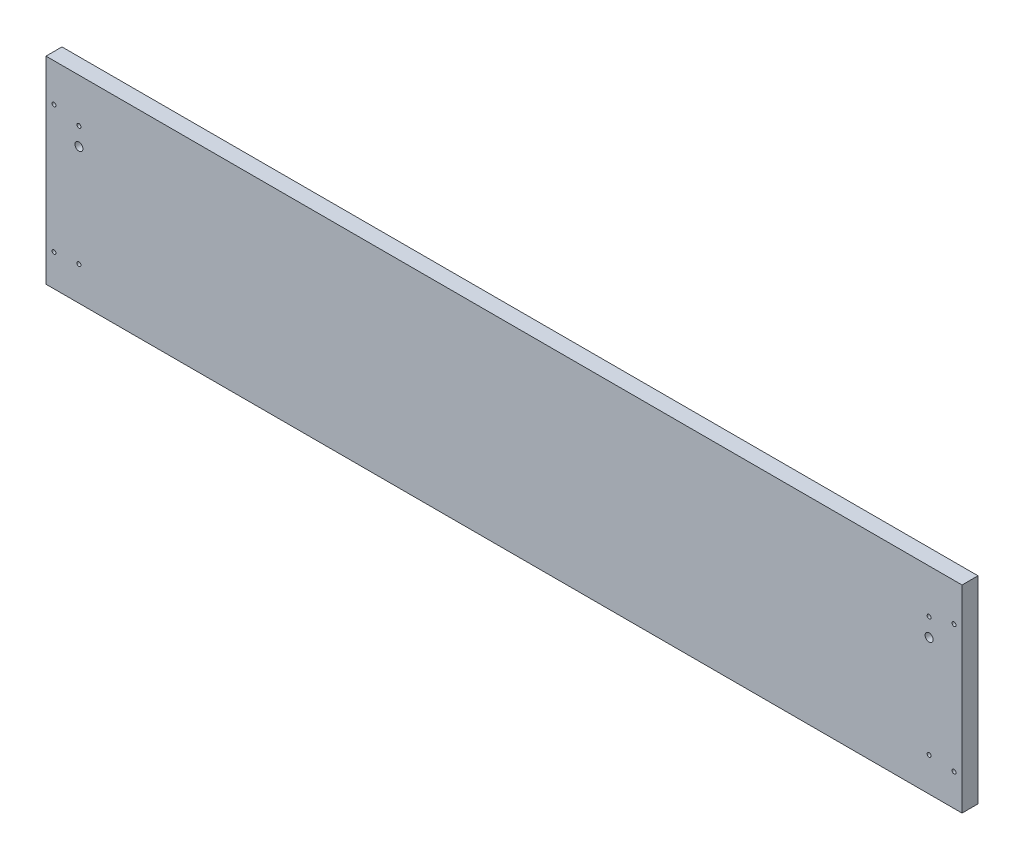
ISO-10303-21;
HEADER;
FILE_DESCRIPTION(('STEP AP214'),'2;1');
FILE_NAME('part.step','',(''),(''),'','','');
FILE_SCHEMA(('AUTOMOTIVE_DESIGN { 1 0 10303 214 1 1 1 1 }'));
ENDSEC;
DATA;
#1=APPLICATION_CONTEXT('core data for automotive mechanical design processes');
#2=APPLICATION_PROTOCOL_DEFINITION('international standard','automotive_design',2000,#1);
#3=PRODUCT_CONTEXT('',#1,'mechanical');
#4=PRODUCT('Part','Part','',(#3));
#5=PRODUCT_RELATED_PRODUCT_CATEGORY('part','',(#4));
#6=PRODUCT_DEFINITION_FORMATION('','',#4);
#7=PRODUCT_DEFINITION_CONTEXT('part definition',#1,'design');
#8=PRODUCT_DEFINITION('design','',#6,#7);
#9=PRODUCT_DEFINITION_SHAPE('','',#8);
#10=(LENGTH_UNIT() NAMED_UNIT(*) SI_UNIT(.MILLI.,.METRE.));
#11=(NAMED_UNIT(*) PLANE_ANGLE_UNIT() SI_UNIT($,.RADIAN.));
#12=(NAMED_UNIT(*) SI_UNIT($,.STERADIAN.) SOLID_ANGLE_UNIT());
#13=UNCERTAINTY_MEASURE_WITH_UNIT(LENGTH_MEASURE(1.E-05),#10,'distance_accuracy_value','');
#14=(GEOMETRIC_REPRESENTATION_CONTEXT(3) GLOBAL_UNCERTAINTY_ASSIGNED_CONTEXT((#13)) GLOBAL_UNIT_ASSIGNED_CONTEXT((#10,
#11,#12)) REPRESENTATION_CONTEXT('',''));
#15=CARTESIAN_POINT('',(0.,0.,0.));
#16=DIRECTION('',(0.,0.,1.));
#17=DIRECTION('',(1.,0.,0.));
#18=AXIS2_PLACEMENT_3D('',#15,#16,#17);
#19=CARTESIAN_POINT('',(-5740.4,1206.5,-12.7));
#20=DIRECTION('',(0.,-1.,0.));
#21=DIRECTION('',(0.,0.,-1.));
#22=AXIS2_PLACEMENT_3D('',#19,#20,#21);
#23=PLANE('',#22);
#24=DIRECTION('',(1.,0.,0.));
#25=VECTOR('',#24,1.);
#26=CARTESIAN_POINT('',(-5740.4,1206.5,0.));
#27=LINE('',#26,#25);
#28=CARTESIAN_POINT('',(-5740.4,1206.5,0.));
#29=VERTEX_POINT('',#28);
#30=CARTESIAN_POINT('',(-5011.7375,1206.5,0.));
#31=VERTEX_POINT('',#30);
#32=EDGE_CURVE('E96',#29,#31,#27,.T.);
#33=ORIENTED_EDGE('',*,*,#32,.F.);
#34=DIRECTION('',(0.,0.,1.));
#35=VECTOR('',#34,1.);
#36=CARTESIAN_POINT('',(-5740.4,1206.5,-12.7));
#37=LINE('',#36,#35);
#38=CARTESIAN_POINT('',(-5740.4,1206.5,-12.7));
#39=VERTEX_POINT('',#38);
#40=EDGE_CURVE('E11',#39,#29,#37,.T.);
#41=ORIENTED_EDGE('',*,*,#40,.F.);
#42=DIRECTION('',(1.,0.,0.));
#43=VECTOR('',#42,1.);
#44=CARTESIAN_POINT('',(-5740.4,1206.5,-12.7));
#45=LINE('',#44,#43);
#46=CARTESIAN_POINT('',(-5011.7375,1206.5,-12.7));
#47=VERTEX_POINT('',#46);
#48=EDGE_CURVE('E89',#39,#47,#45,.T.);
#49=ORIENTED_EDGE('',*,*,#48,.T.);
#50=DIRECTION('',(0.,0.,1.));
#51=VECTOR('',#50,1.);
#52=CARTESIAN_POINT('',(-5011.7375,1206.5,-12.7));
#53=LINE('',#52,#51);
#54=EDGE_CURVE('E34',#47,#31,#53,.T.);
#55=ORIENTED_EDGE('',*,*,#54,.T.);
#56=EDGE_LOOP('',(#33,#41,#49,#55));
#57=FACE_BOUND('',#56,.T.);
#58=ADVANCED_FACE('F31',(#57),#23,.T.);
#59=CARTESIAN_POINT('',(-5740.4,1363.6625,-12.7));
#60=DIRECTION('',(-1.,0.,0.));
#61=DIRECTION('',(0.,0.,1.));
#62=AXIS2_PLACEMENT_3D('',#59,#60,#61);
#63=PLANE('',#62);
#64=DIRECTION('',(0.,-1.,0.));
#65=VECTOR('',#64,1.);
#66=CARTESIAN_POINT('',(-5740.4,1363.6625,0.));
#67=LINE('',#66,#65);
#68=CARTESIAN_POINT('',(-5740.4,1363.6625,0.));
#69=VERTEX_POINT('',#68);
#70=EDGE_CURVE('E91',#69,#29,#67,.T.);
#71=ORIENTED_EDGE('',*,*,#70,.F.);
#72=DIRECTION('',(0.,0.,1.));
#73=VECTOR('',#72,1.);
#74=CARTESIAN_POINT('',(-5740.4,1363.6625,-12.7));
#75=LINE('',#74,#73);
#76=CARTESIAN_POINT('',(-5740.4,1363.6625,-12.7));
#77=VERTEX_POINT('',#76);
#78=EDGE_CURVE('E40',#77,#69,#75,.T.);
#79=ORIENTED_EDGE('',*,*,#78,.F.);
#80=DIRECTION('',(0.,-1.,0.));
#81=VECTOR('',#80,1.);
#82=CARTESIAN_POINT('',(-5740.4,1363.6625,-12.7));
#83=LINE('',#82,#81);
#84=EDGE_CURVE('E86',#77,#39,#83,.T.);
#85=ORIENTED_EDGE('',*,*,#84,.T.);
#86=ORIENTED_EDGE('',*,*,#40,.T.);
#87=EDGE_LOOP('',(#71,#79,#85,#86));
#88=FACE_BOUND('',#87,.T.);
#89=ADVANCED_FACE('F107',(#88),#63,.T.);
#90=CARTESIAN_POINT('',(-5011.7375,1363.6625,-12.7));
#91=DIRECTION('',(0.,1.,0.));
#92=DIRECTION('',(0.,0.,1.));
#93=AXIS2_PLACEMENT_3D('',#90,#91,#92);
#94=PLANE('',#93);
#95=DIRECTION('',(-1.,0.,0.));
#96=VECTOR('',#95,1.);
#97=CARTESIAN_POINT('',(-5011.7375,1363.6625,0.));
#98=LINE('',#97,#96);
#99=CARTESIAN_POINT('',(-5011.7375,1363.6625,0.));
#100=VERTEX_POINT('',#99);
#101=EDGE_CURVE('E81',#100,#69,#98,.T.);
#102=ORIENTED_EDGE('',*,*,#101,.F.);
#103=DIRECTION('',(0.,0.,1.));
#104=VECTOR('',#103,1.);
#105=CARTESIAN_POINT('',(-5011.7375,1363.6625,-12.7));
#106=LINE('',#105,#104);
#107=CARTESIAN_POINT('',(-5011.7375,1363.6625,-12.7));
#108=VERTEX_POINT('',#107);
#109=EDGE_CURVE('E76',#108,#100,#106,.T.);
#110=ORIENTED_EDGE('',*,*,#109,.F.);
#111=DIRECTION('',(-1.,0.,0.));
#112=VECTOR('',#111,1.);
#113=CARTESIAN_POINT('',(-5011.7375,1363.6625,-12.7));
#114=LINE('',#113,#112);
#115=EDGE_CURVE('E79',#108,#77,#114,.T.);
#116=ORIENTED_EDGE('',*,*,#115,.T.);
#117=ORIENTED_EDGE('',*,*,#78,.T.);
#118=EDGE_LOOP('',(#102,#110,#116,#117));
#119=FACE_BOUND('',#118,.T.);
#120=ADVANCED_FACE('F78',(#119),#94,.T.);
#121=CARTESIAN_POINT('',(-5011.7375,1206.5,-12.7));
#122=DIRECTION('',(1.,0.,0.));
#123=DIRECTION('',(0.,0.,-1.));
#124=AXIS2_PLACEMENT_3D('',#121,#122,#123);
#125=PLANE('',#124);
#126=DIRECTION('',(0.,1.,0.));
#127=VECTOR('',#126,1.);
#128=CARTESIAN_POINT('',(-5011.7375,1206.5,0.));
#129=LINE('',#128,#127);
#130=EDGE_CURVE('E99',#31,#100,#129,.T.);
#131=ORIENTED_EDGE('',*,*,#130,.F.);
#132=ORIENTED_EDGE('',*,*,#54,.F.);
#133=DIRECTION('',(0.,1.,0.));
#134=VECTOR('',#133,1.);
#135=CARTESIAN_POINT('',(-5011.7375,1206.5,-12.7));
#136=LINE('',#135,#134);
#137=EDGE_CURVE('E85',#47,#108,#136,.T.);
#138=ORIENTED_EDGE('',*,*,#137,.T.);
#139=ORIENTED_EDGE('',*,*,#109,.T.);
#140=EDGE_LOOP('',(#131,#132,#138,#139));
#141=FACE_BOUND('',#140,.T.);
#142=ADVANCED_FACE('F88',(#141),#125,.T.);
#143=CARTESIAN_POINT('',(-5011.7375,1206.5,-12.7));
#144=DIRECTION('',(0.,0.,1.));
#145=DIRECTION('',(1.,0.,0.));
#146=AXIS2_PLACEMENT_3D('',#143,#144,#145);
#147=PLANE('',#146);
#148=CARTESIAN_POINT('',(-5018.0875,1231.9,-12.7));
#149=DIRECTION('',(0.,0.,1.));
#150=DIRECTION('',(1.,0.,0.));
#151=AXIS2_PLACEMENT_3D('',#148,#149,#150);
#152=CIRCLE('',#151,1.58750000000051);
#153=CARTESIAN_POINT('',(-5016.5,1231.9,-12.7));
#154=VERTEX_POINT('',#153);
#155=EDGE_CURVE('E172',#154,#154,#152,.F.);
#156=ORIENTED_EDGE('',*,*,#155,.F.);
#157=EDGE_LOOP('',(#156));
#158=FACE_BOUND('',#157,.T.);
#159=CARTESIAN_POINT('',(-5037.93125,1233.4875,-12.7));
#160=DIRECTION('',(0.,0.,1.));
#161=DIRECTION('',(1.,0.,0.));
#162=AXIS2_PLACEMENT_3D('',#159,#160,#161);
#163=CIRCLE('',#162,1.58750000000051);
#164=CARTESIAN_POINT('',(-5036.34375,1233.4875,-12.7));
#165=VERTEX_POINT('',#164);
#166=EDGE_CURVE('E182',#165,#165,#163,.F.);
#167=ORIENTED_EDGE('',*,*,#166,.F.);
#168=EDGE_LOOP('',(#167));
#169=FACE_BOUND('',#168,.T.);
#170=CARTESIAN_POINT('',(-5018.0875,1333.5,-12.7));
#171=DIRECTION('',(0.,0.,1.));
#172=DIRECTION('',(1.,0.,0.));
#173=AXIS2_PLACEMENT_3D('',#170,#171,#172);
#174=CIRCLE('',#173,1.58750000000051);
#175=CARTESIAN_POINT('',(-5016.5,1333.5,-12.7));
#176=VERTEX_POINT('',#175);
#177=EDGE_CURVE('E188',#176,#176,#174,.F.);
#178=ORIENTED_EDGE('',*,*,#177,.F.);
#179=EDGE_LOOP('',(#178));
#180=FACE_BOUND('',#179,.T.);
#181=CARTESIAN_POINT('',(-5037.93125,1328.7375,-12.7));
#182=DIRECTION('',(0.,0.,1.));
#183=DIRECTION('',(1.,0.,0.));
#184=AXIS2_PLACEMENT_3D('',#181,#182,#183);
#185=CIRCLE('',#184,1.58750000000051);
#186=CARTESIAN_POINT('',(-5036.34375,1328.7375,-12.7));
#187=VERTEX_POINT('',#186);
#188=EDGE_CURVE('E194',#187,#187,#185,.F.);
#189=ORIENTED_EDGE('',*,*,#188,.F.);
#190=EDGE_LOOP('',(#189));
#191=FACE_BOUND('',#190,.T.);
#192=CARTESIAN_POINT('',(-5037.93125,1314.45,-12.7));
#193=DIRECTION('',(0.,0.,1.));
#194=DIRECTION('',(1.,0.,0.));
#195=AXIS2_PLACEMENT_3D('',#192,#193,#194);
#196=CIRCLE('',#195,3.17500000000004);
#197=CARTESIAN_POINT('',(-5034.75625,1314.45,-12.7));
#198=VERTEX_POINT('',#197);
#199=EDGE_CURVE('E200',#198,#198,#196,.F.);
#200=ORIENTED_EDGE('',*,*,#199,.F.);
#201=EDGE_LOOP('',(#200));
#202=FACE_BOUND('',#201,.T.);
#203=CARTESIAN_POINT('',(-5714.20625,1233.4875,-12.7));
#204=DIRECTION('',(0.,0.,1.));
#205=DIRECTION('',(1.,0.,0.));
#206=AXIS2_PLACEMENT_3D('',#203,#204,#205);
#207=CIRCLE('',#206,1.58750000000045);
#208=CARTESIAN_POINT('',(-5712.61875,1233.4875,-12.7));
#209=VERTEX_POINT('',#208);
#210=EDGE_CURVE('E206',#209,#209,#207,.F.);
#211=ORIENTED_EDGE('',*,*,#210,.F.);
#212=EDGE_LOOP('',(#211));
#213=FACE_BOUND('',#212,.T.);
#214=CARTESIAN_POINT('',(-5734.05,1231.9,-12.7));
#215=DIRECTION('',(0.,0.,1.));
#216=DIRECTION('',(1.,0.,0.));
#217=AXIS2_PLACEMENT_3D('',#214,#215,#216);
#218=CIRCLE('',#217,1.58750000000051);
#219=CARTESIAN_POINT('',(-5732.4625,1231.9,-12.7));
#220=VERTEX_POINT('',#219);
#221=EDGE_CURVE('E212',#220,#220,#218,.F.);
#222=ORIENTED_EDGE('',*,*,#221,.F.);
#223=EDGE_LOOP('',(#222));
#224=FACE_BOUND('',#223,.T.);
#225=CARTESIAN_POINT('',(-5734.05,1333.5,-12.7));
#226=DIRECTION('',(0.,0.,1.));
#227=DIRECTION('',(1.,0.,0.));
#228=AXIS2_PLACEMENT_3D('',#225,#226,#227);
#229=CIRCLE('',#228,1.58750000000051);
#230=CARTESIAN_POINT('',(-5732.4625,1333.5,-12.7));
#231=VERTEX_POINT('',#230);
#232=EDGE_CURVE('E218',#231,#231,#229,.F.);
#233=ORIENTED_EDGE('',*,*,#232,.F.);
#234=EDGE_LOOP('',(#233));
#235=FACE_BOUND('',#234,.T.);
#236=CARTESIAN_POINT('',(-5714.20625,1328.7375,-12.7));
#237=DIRECTION('',(0.,0.,1.));
#238=DIRECTION('',(1.,0.,0.));
#239=AXIS2_PLACEMENT_3D('',#236,#237,#238);
#240=CIRCLE('',#239,1.5874999999996);
#241=CARTESIAN_POINT('',(-5712.61875,1328.7375,-12.7));
#242=VERTEX_POINT('',#241);
#243=EDGE_CURVE('E224',#242,#242,#240,.F.);
#244=ORIENTED_EDGE('',*,*,#243,.F.);
#245=EDGE_LOOP('',(#244));
#246=FACE_BOUND('',#245,.T.);
#247=CARTESIAN_POINT('',(-5714.20625,1314.45,-12.7));
#248=DIRECTION('',(0.,0.,1.));
#249=DIRECTION('',(1.,0.,0.));
#250=AXIS2_PLACEMENT_3D('',#247,#248,#249);
#251=CIRCLE('',#250,3.1749999999992);
#252=CARTESIAN_POINT('',(-5711.03125,1314.45,-12.7));
#253=VERTEX_POINT('',#252);
#254=EDGE_CURVE('E100',#253,#253,#251,.F.);
#255=ORIENTED_EDGE('',*,*,#254,.F.);
#256=EDGE_LOOP('',(#255));
#257=FACE_BOUND('',#256,.T.);
#258=ORIENTED_EDGE('',*,*,#48,.F.);
#259=ORIENTED_EDGE('',*,*,#84,.F.);
#260=ORIENTED_EDGE('',*,*,#115,.F.);
#261=ORIENTED_EDGE('',*,*,#137,.F.);
#262=EDGE_LOOP('',(#258,#259,#260,#261));
#263=FACE_BOUND('',#262,.T.);
#264=ADVANCED_FACE('F84',(#158,#169,#180,#191,#202,#213,#224,#235,#246,#257,#263),#147,.F.);
#265=CARTESIAN_POINT('',(-5011.7375,1206.5,0.));
#266=DIRECTION('',(0.,0.,1.));
#267=DIRECTION('',(1.,0.,0.));
#268=AXIS2_PLACEMENT_3D('',#265,#266,#267);
#269=PLANE('',#268);
#270=CARTESIAN_POINT('',(-5018.0875,1231.9,0.));
#271=DIRECTION('',(0.,0.,1.));
#272=DIRECTION('',(1.,0.,0.));
#273=AXIS2_PLACEMENT_3D('',#270,#271,#272);
#274=CIRCLE('',#273,1.58750000000051);
#275=CARTESIAN_POINT('',(-5016.5,1231.9,0.));
#276=VERTEX_POINT('',#275);
#277=EDGE_CURVE('E175',#276,#276,#274,.T.);
#278=ORIENTED_EDGE('',*,*,#277,.F.);
#279=EDGE_LOOP('',(#278));
#280=FACE_BOUND('',#279,.T.);
#281=CARTESIAN_POINT('',(-5037.93125,1233.4875,0.));
#282=DIRECTION('',(0.,0.,1.));
#283=DIRECTION('',(1.,0.,0.));
#284=AXIS2_PLACEMENT_3D('',#281,#282,#283);
#285=CIRCLE('',#284,1.58750000000051);
#286=CARTESIAN_POINT('',(-5036.34375,1233.4875,0.));
#287=VERTEX_POINT('',#286);
#288=EDGE_CURVE('E177',#287,#287,#285,.T.);
#289=ORIENTED_EDGE('',*,*,#288,.F.);
#290=EDGE_LOOP('',(#289));
#291=FACE_BOUND('',#290,.T.);
#292=CARTESIAN_POINT('',(-5018.0875,1333.5,0.));
#293=DIRECTION('',(0.,0.,1.));
#294=DIRECTION('',(1.,0.,0.));
#295=AXIS2_PLACEMENT_3D('',#292,#293,#294);
#296=CIRCLE('',#295,1.58750000000051);
#297=CARTESIAN_POINT('',(-5016.5,1333.5,0.));
#298=VERTEX_POINT('',#297);
#299=EDGE_CURVE('E185',#298,#298,#296,.T.);
#300=ORIENTED_EDGE('',*,*,#299,.F.);
#301=EDGE_LOOP('',(#300));
#302=FACE_BOUND('',#301,.T.);
#303=CARTESIAN_POINT('',(-5037.93125,1328.7375,0.));
#304=DIRECTION('',(0.,0.,1.));
#305=DIRECTION('',(1.,0.,0.));
#306=AXIS2_PLACEMENT_3D('',#303,#304,#305);
#307=CIRCLE('',#306,1.58750000000051);
#308=CARTESIAN_POINT('',(-5036.34375,1328.7375,0.));
#309=VERTEX_POINT('',#308);
#310=EDGE_CURVE('E191',#309,#309,#307,.T.);
#311=ORIENTED_EDGE('',*,*,#310,.F.);
#312=EDGE_LOOP('',(#311));
#313=FACE_BOUND('',#312,.T.);
#314=CARTESIAN_POINT('',(-5037.93125,1314.45,0.));
#315=DIRECTION('',(0.,0.,1.));
#316=DIRECTION('',(1.,0.,0.));
#317=AXIS2_PLACEMENT_3D('',#314,#315,#316);
#318=CIRCLE('',#317,3.17500000000004);
#319=CARTESIAN_POINT('',(-5034.75625,1314.45,0.));
#320=VERTEX_POINT('',#319);
#321=EDGE_CURVE('E197',#320,#320,#318,.T.);
#322=ORIENTED_EDGE('',*,*,#321,.F.);
#323=EDGE_LOOP('',(#322));
#324=FACE_BOUND('',#323,.T.);
#325=CARTESIAN_POINT('',(-5714.20625,1233.4875,0.));
#326=DIRECTION('',(0.,0.,1.));
#327=DIRECTION('',(1.,0.,0.));
#328=AXIS2_PLACEMENT_3D('',#325,#326,#327);
#329=CIRCLE('',#328,1.58750000000045);
#330=CARTESIAN_POINT('',(-5712.61875,1233.4875,0.));
#331=VERTEX_POINT('',#330);
#332=EDGE_CURVE('E203',#331,#331,#329,.T.);
#333=ORIENTED_EDGE('',*,*,#332,.F.);
#334=EDGE_LOOP('',(#333));
#335=FACE_BOUND('',#334,.T.);
#336=CARTESIAN_POINT('',(-5734.05,1231.9,0.));
#337=DIRECTION('',(0.,0.,1.));
#338=DIRECTION('',(1.,0.,0.));
#339=AXIS2_PLACEMENT_3D('',#336,#337,#338);
#340=CIRCLE('',#339,1.58750000000051);
#341=CARTESIAN_POINT('',(-5732.4625,1231.9,0.));
#342=VERTEX_POINT('',#341);
#343=EDGE_CURVE('E209',#342,#342,#340,.T.);
#344=ORIENTED_EDGE('',*,*,#343,.F.);
#345=EDGE_LOOP('',(#344));
#346=FACE_BOUND('',#345,.T.);
#347=CARTESIAN_POINT('',(-5734.05,1333.5,0.));
#348=DIRECTION('',(0.,0.,1.));
#349=DIRECTION('',(1.,0.,0.));
#350=AXIS2_PLACEMENT_3D('',#347,#348,#349);
#351=CIRCLE('',#350,1.58750000000051);
#352=CARTESIAN_POINT('',(-5732.4625,1333.5,0.));
#353=VERTEX_POINT('',#352);
#354=EDGE_CURVE('E215',#353,#353,#351,.T.);
#355=ORIENTED_EDGE('',*,*,#354,.F.);
#356=EDGE_LOOP('',(#355));
#357=FACE_BOUND('',#356,.T.);
#358=CARTESIAN_POINT('',(-5714.20625,1328.7375,0.));
#359=DIRECTION('',(0.,0.,1.));
#360=DIRECTION('',(1.,0.,0.));
#361=AXIS2_PLACEMENT_3D('',#358,#359,#360);
#362=CIRCLE('',#361,1.5874999999996);
#363=CARTESIAN_POINT('',(-5712.61875,1328.7375,0.));
#364=VERTEX_POINT('',#363);
#365=EDGE_CURVE('E221',#364,#364,#362,.T.);
#366=ORIENTED_EDGE('',*,*,#365,.F.);
#367=EDGE_LOOP('',(#366));
#368=FACE_BOUND('',#367,.T.);
#369=CARTESIAN_POINT('',(-5714.20625,1314.45,0.));
#370=DIRECTION('',(0.,0.,1.));
#371=DIRECTION('',(1.,0.,0.));
#372=AXIS2_PLACEMENT_3D('',#369,#370,#371);
#373=CIRCLE('',#372,3.1749999999992);
#374=CARTESIAN_POINT('',(-5711.03125,1314.45,0.));
#375=VERTEX_POINT('',#374);
#376=EDGE_CURVE('E227',#375,#375,#373,.T.);
#377=ORIENTED_EDGE('',*,*,#376,.F.);
#378=EDGE_LOOP('',(#377));
#379=FACE_BOUND('',#378,.T.);
#380=ORIENTED_EDGE('',*,*,#32,.T.);
#381=ORIENTED_EDGE('',*,*,#130,.T.);
#382=ORIENTED_EDGE('',*,*,#101,.T.);
#383=ORIENTED_EDGE('',*,*,#70,.T.);
#384=EDGE_LOOP('',(#380,#381,#382,#383));
#385=FACE_BOUND('',#384,.T.);
#386=ADVANCED_FACE('F106',(#280,#291,#302,#313,#324,#335,#346,#357,#368,#379,#385),#269,.T.);
#387=CARTESIAN_POINT('',(-5714.20625,1314.45,-21.6802561210689));
#388=DIRECTION('',(0.,0.,1.));
#389=DIRECTION('',(1.,0.,0.));
#390=AXIS2_PLACEMENT_3D('',#387,#388,#389);
#391=CYLINDRICAL_SURFACE('',#390,3.1749999999992);
#392=ORIENTED_EDGE('',*,*,#254,.T.);
#393=EDGE_LOOP('',(#392));
#394=FACE_BOUND('',#393,.T.);
#395=ORIENTED_EDGE('',*,*,#376,.T.);
#396=EDGE_LOOP('',(#395));
#397=FACE_BOUND('',#396,.T.);
#398=ADVANCED_FACE('F125',(#394,#397),#391,.F.);
#399=CARTESIAN_POINT('',(-5714.20625,1328.7375,-21.6802561210689));
#400=DIRECTION('',(0.,0.,1.));
#401=DIRECTION('',(1.,0.,0.));
#402=AXIS2_PLACEMENT_3D('',#399,#400,#401);
#403=CYLINDRICAL_SURFACE('',#402,1.5874999999996);
#404=ORIENTED_EDGE('',*,*,#243,.T.);
#405=EDGE_LOOP('',(#404));
#406=FACE_BOUND('',#405,.T.);
#407=ORIENTED_EDGE('',*,*,#365,.T.);
#408=EDGE_LOOP('',(#407));
#409=FACE_BOUND('',#408,.T.);
#410=ADVANCED_FACE('F132',(#406,#409),#403,.F.);
#411=CARTESIAN_POINT('',(-5734.05,1333.5,-21.6802561210689));
#412=DIRECTION('',(0.,0.,1.));
#413=DIRECTION('',(1.,0.,0.));
#414=AXIS2_PLACEMENT_3D('',#411,#412,#413);
#415=CYLINDRICAL_SURFACE('',#414,1.58750000000051);
#416=ORIENTED_EDGE('',*,*,#232,.T.);
#417=EDGE_LOOP('',(#416));
#418=FACE_BOUND('',#417,.T.);
#419=ORIENTED_EDGE('',*,*,#354,.T.);
#420=EDGE_LOOP('',(#419));
#421=FACE_BOUND('',#420,.T.);
#422=ADVANCED_FACE('F136',(#418,#421),#415,.F.);
#423=CARTESIAN_POINT('',(-5734.05,1231.9,-21.6802561210689));
#424=DIRECTION('',(0.,0.,1.));
#425=DIRECTION('',(1.,0.,0.));
#426=AXIS2_PLACEMENT_3D('',#423,#424,#425);
#427=CYLINDRICAL_SURFACE('',#426,1.58750000000051);
#428=ORIENTED_EDGE('',*,*,#221,.T.);
#429=EDGE_LOOP('',(#428));
#430=FACE_BOUND('',#429,.T.);
#431=ORIENTED_EDGE('',*,*,#343,.T.);
#432=EDGE_LOOP('',(#431));
#433=FACE_BOUND('',#432,.T.);
#434=ADVANCED_FACE('F140',(#430,#433),#427,.F.);
#435=CARTESIAN_POINT('',(-5714.20625,1233.4875,-21.6802561210689));
#436=DIRECTION('',(0.,0.,1.));
#437=DIRECTION('',(1.,0.,0.));
#438=AXIS2_PLACEMENT_3D('',#435,#436,#437);
#439=CYLINDRICAL_SURFACE('',#438,1.58750000000045);
#440=ORIENTED_EDGE('',*,*,#210,.T.);
#441=EDGE_LOOP('',(#440));
#442=FACE_BOUND('',#441,.T.);
#443=ORIENTED_EDGE('',*,*,#332,.T.);
#444=EDGE_LOOP('',(#443));
#445=FACE_BOUND('',#444,.T.);
#446=ADVANCED_FACE('F144',(#442,#445),#439,.F.);
#447=CARTESIAN_POINT('',(-5037.93125,1314.45,-21.6802561210689));
#448=DIRECTION('',(0.,0.,1.));
#449=DIRECTION('',(1.,0.,0.));
#450=AXIS2_PLACEMENT_3D('',#447,#448,#449);
#451=CYLINDRICAL_SURFACE('',#450,3.17500000000004);
#452=ORIENTED_EDGE('',*,*,#199,.T.);
#453=EDGE_LOOP('',(#452));
#454=FACE_BOUND('',#453,.T.);
#455=ORIENTED_EDGE('',*,*,#321,.T.);
#456=EDGE_LOOP('',(#455));
#457=FACE_BOUND('',#456,.T.);
#458=ADVANCED_FACE('F148',(#454,#457),#451,.F.);
#459=CARTESIAN_POINT('',(-5037.93125,1328.7375,-21.6802561210689));
#460=DIRECTION('',(0.,0.,1.));
#461=DIRECTION('',(1.,0.,0.));
#462=AXIS2_PLACEMENT_3D('',#459,#460,#461);
#463=CYLINDRICAL_SURFACE('',#462,1.58750000000051);
#464=ORIENTED_EDGE('',*,*,#188,.T.);
#465=EDGE_LOOP('',(#464));
#466=FACE_BOUND('',#465,.T.);
#467=ORIENTED_EDGE('',*,*,#310,.T.);
#468=EDGE_LOOP('',(#467));
#469=FACE_BOUND('',#468,.T.);
#470=ADVANCED_FACE('F152',(#466,#469),#463,.F.);
#471=CARTESIAN_POINT('',(-5018.0875,1333.5,-21.6802561210689));
#472=DIRECTION('',(0.,0.,1.));
#473=DIRECTION('',(1.,0.,0.));
#474=AXIS2_PLACEMENT_3D('',#471,#472,#473);
#475=CYLINDRICAL_SURFACE('',#474,1.58750000000051);
#476=ORIENTED_EDGE('',*,*,#177,.T.);
#477=EDGE_LOOP('',(#476));
#478=FACE_BOUND('',#477,.T.);
#479=ORIENTED_EDGE('',*,*,#299,.T.);
#480=EDGE_LOOP('',(#479));
#481=FACE_BOUND('',#480,.T.);
#482=ADVANCED_FACE('F156',(#478,#481),#475,.F.);
#483=CARTESIAN_POINT('',(-5037.93125,1233.4875,-21.6802561210689));
#484=DIRECTION('',(0.,0.,1.));
#485=DIRECTION('',(1.,0.,0.));
#486=AXIS2_PLACEMENT_3D('',#483,#484,#485);
#487=CYLINDRICAL_SURFACE('',#486,1.58750000000051);
#488=ORIENTED_EDGE('',*,*,#166,.T.);
#489=EDGE_LOOP('',(#488));
#490=FACE_BOUND('',#489,.T.);
#491=ORIENTED_EDGE('',*,*,#288,.T.);
#492=EDGE_LOOP('',(#491));
#493=FACE_BOUND('',#492,.T.);
#494=ADVANCED_FACE('F160',(#490,#493),#487,.F.);
#495=CARTESIAN_POINT('',(-5018.0875,1231.9,-21.6802561210689));
#496=DIRECTION('',(0.,0.,1.));
#497=DIRECTION('',(1.,0.,0.));
#498=AXIS2_PLACEMENT_3D('',#495,#496,#497);
#499=CYLINDRICAL_SURFACE('',#498,1.58750000000051);
#500=ORIENTED_EDGE('',*,*,#155,.T.);
#501=EDGE_LOOP('',(#500));
#502=FACE_BOUND('',#501,.T.);
#503=ORIENTED_EDGE('',*,*,#277,.T.);
#504=EDGE_LOOP('',(#503));
#505=FACE_BOUND('',#504,.T.);
#506=ADVANCED_FACE('F164',(#502,#505),#499,.F.);
#507=CLOSED_SHELL('',(#58,#89,#120,#142,#264,#386,#398,#410,#422,#434,#446,#458,#470,#482,#494,#506));
#508=MANIFOLD_SOLID_BREP('B2',#507);
#509=ADVANCED_BREP_SHAPE_REPRESENTATION('',(#18,#508),#14);
#510=SHAPE_DEFINITION_REPRESENTATION(#9,#509);
ENDSEC;
END-ISO-10303-21;
